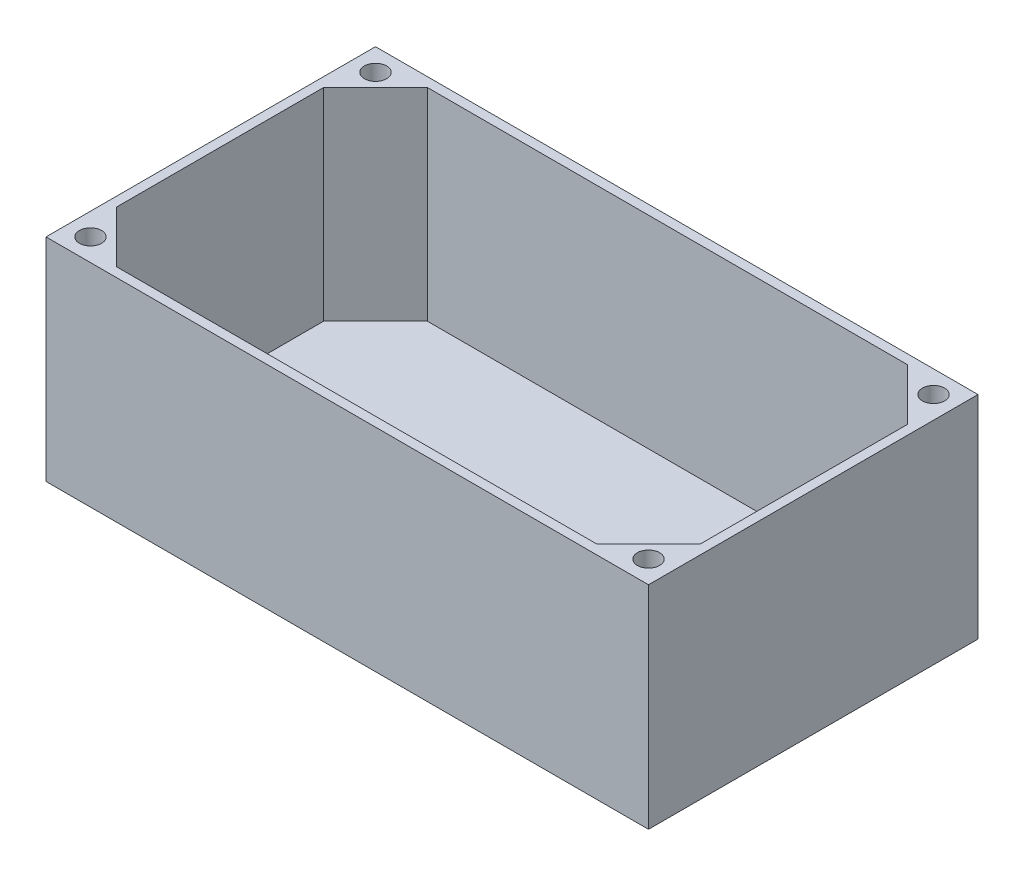
ISO-10303-21;
HEADER;
FILE_DESCRIPTION(('STEP AP214'),'2;1');
FILE_NAME('part.step','',(''),(''),'','','');
FILE_SCHEMA(('AUTOMOTIVE_DESIGN { 1 0 10303 214 1 1 1 1 }'));
ENDSEC;
DATA;
#1=APPLICATION_CONTEXT('core data for automotive mechanical design processes');
#2=APPLICATION_PROTOCOL_DEFINITION('international standard','automotive_design',2000,#1);
#3=PRODUCT_CONTEXT('',#1,'mechanical');
#4=PRODUCT('Part','Part','',(#3));
#5=PRODUCT_RELATED_PRODUCT_CATEGORY('part','',(#4));
#6=PRODUCT_DEFINITION_FORMATION('','',#4);
#7=PRODUCT_DEFINITION_CONTEXT('part definition',#1,'design');
#8=PRODUCT_DEFINITION('design','',#6,#7);
#9=PRODUCT_DEFINITION_SHAPE('','',#8);
#10=(LENGTH_UNIT() NAMED_UNIT(*) SI_UNIT(.MILLI.,.METRE.));
#11=(NAMED_UNIT(*) PLANE_ANGLE_UNIT() SI_UNIT($,.RADIAN.));
#12=(NAMED_UNIT(*) SI_UNIT($,.STERADIAN.) SOLID_ANGLE_UNIT());
#13=UNCERTAINTY_MEASURE_WITH_UNIT(LENGTH_MEASURE(1.E-05),#10,'distance_accuracy_value','');
#14=(GEOMETRIC_REPRESENTATION_CONTEXT(3) GLOBAL_UNCERTAINTY_ASSIGNED_CONTEXT((#13)) GLOBAL_UNIT_ASSIGNED_CONTEXT((#10,
#11,#12)) REPRESENTATION_CONTEXT('',''));
#15=CARTESIAN_POINT('',(0.,0.,0.));
#16=DIRECTION('',(0.,0.,1.));
#17=DIRECTION('',(1.,0.,0.));
#18=AXIS2_PLACEMENT_3D('',#15,#16,#17);
#19=CARTESIAN_POINT('',(0.,1.27,0.));
#20=DIRECTION('',(0.,-1.,0.));
#21=DIRECTION('',(0.,0.,-1.));
#22=AXIS2_PLACEMENT_3D('',#19,#20,#21);
#23=PLANE('',#22);
#24=CARTESIAN_POINT('',(67.31,1.27,-31.75));
#25=DIRECTION('',(0.,-1.,0.));
#26=DIRECTION('',(0.,0.,-1.));
#27=AXIS2_PLACEMENT_3D('',#24,#25,#26);
#28=CIRCLE('',#27,4.445);
#29=CARTESIAN_POINT('',(67.31,1.27,-36.195));
#30=VERTEX_POINT('',#29);
#31=EDGE_CURVE('E48',#30,#30,#28,.F.);
#32=ORIENTED_EDGE('',*,*,#31,.F.);
#33=EDGE_LOOP('',(#32));
#34=FACE_BOUND('',#33,.T.);
#35=DIRECTION('',(0.,0.,1.));
#36=VECTOR('',#35,1.);
#37=CARTESIAN_POINT('',(1.27,1.27,0.));
#38=LINE('',#37,#36);
#39=CARTESIAN_POINT('',(1.26999999999998,1.27,-36.195));
#40=VERTEX_POINT('',#39);
#41=CARTESIAN_POINT('',(1.26999999999999,1.27,-8.25500000000007));
#42=VERTEX_POINT('',#41);
#43=EDGE_CURVE('E287',#40,#42,#38,.T.);
#44=ORIENTED_EDGE('',*,*,#43,.T.);
#45=DIRECTION('',(-0.707106781186544,0.,-0.707106781186551));
#46=VECTOR('',#45,1.);
#47=CARTESIAN_POINT('',(1.26999999999999,1.27,-8.25500000000007));
#48=LINE('',#47,#46);
#49=CARTESIAN_POINT('',(8.255,1.27,-1.27));
#50=VERTEX_POINT('',#49);
#51=EDGE_CURVE('E362',#42,#50,#48,.F.);
#52=ORIENTED_EDGE('',*,*,#51,.T.);
#53=DIRECTION('',(1.,0.,0.));
#54=VECTOR('',#53,1.);
#55=CARTESIAN_POINT('',(0.,1.27,-1.27));
#56=LINE('',#55,#54);
#57=CARTESIAN_POINT('',(73.0249999999999,1.27,-1.27));
#58=VERTEX_POINT('',#57);
#59=EDGE_CURVE('E292',#50,#58,#56,.T.);
#60=ORIENTED_EDGE('',*,*,#59,.T.);
#61=DIRECTION('',(-0.70710678118655,0.,0.707106781186545));
#62=VECTOR('',#61,1.);
#63=CARTESIAN_POINT('',(73.0249999999999,1.27,-1.27));
#64=LINE('',#63,#62);
#65=CARTESIAN_POINT('',(80.01,1.27,-8.25499999999999));
#66=VERTEX_POINT('',#65);
#67=EDGE_CURVE('E360',#58,#66,#64,.F.);
#68=ORIENTED_EDGE('',*,*,#67,.T.);
#69=DIRECTION('',(0.,0.,-1.));
#70=VECTOR('',#69,1.);
#71=CARTESIAN_POINT('',(80.01,1.27,0.));
#72=LINE('',#71,#70);
#73=CARTESIAN_POINT('',(80.01,1.27,-36.1949999999999));
#74=VERTEX_POINT('',#73);
#75=EDGE_CURVE('E295',#66,#74,#72,.T.);
#76=ORIENTED_EDGE('',*,*,#75,.T.);
#77=DIRECTION('',(0.707106781186544,0.,0.707106781186551));
#78=VECTOR('',#77,1.);
#79=CARTESIAN_POINT('',(80.01,1.27,-36.1949999999999));
#80=LINE('',#79,#78);
#81=CARTESIAN_POINT('',(73.025,1.27,-43.18));
#82=VERTEX_POINT('',#81);
#83=EDGE_CURVE('E357',#74,#82,#80,.F.);
#84=ORIENTED_EDGE('',*,*,#83,.T.);
#85=DIRECTION('',(-1.,0.,0.));
#86=VECTOR('',#85,1.);
#87=CARTESIAN_POINT('',(0.,1.27,-43.18));
#88=LINE('',#87,#86);
#89=CARTESIAN_POINT('',(8.25500000000001,1.27,-43.18));
#90=VERTEX_POINT('',#89);
#91=EDGE_CURVE('E299',#82,#90,#88,.T.);
#92=ORIENTED_EDGE('',*,*,#91,.T.);
#93=DIRECTION('',(0.70710678118655,0.,-0.707106781186545));
#94=VECTOR('',#93,1.);
#95=CARTESIAN_POINT('',(8.25500000000001,1.27,-43.18));
#96=LINE('',#95,#94);
#97=EDGE_CURVE('E355',#90,#40,#96,.F.);
#98=ORIENTED_EDGE('',*,*,#97,.T.);
#99=EDGE_LOOP('',(#44,#52,#60,#68,#76,#84,#92,#98));
#100=FACE_BOUND('',#99,.T.);
#101=DIRECTION('',(-1.,0.,0.));
#102=VECTOR('',#101,1.);
#103=CARTESIAN_POINT('',(5.61999999999998,1.27,-28.225));
#104=LINE('',#103,#102);
#105=CARTESIAN_POINT('',(9.61999999999998,1.27,-28.225));
#106=VERTEX_POINT('',#105);
#107=CARTESIAN_POINT('',(5.61999999999998,1.27,-28.225));
#108=VERTEX_POINT('',#107);
#109=EDGE_CURVE('E248',#106,#108,#104,.T.);
#110=ORIENTED_EDGE('',*,*,#109,.F.);
#111=DIRECTION('',(0.,0.,-1.));
#112=VECTOR('',#111,1.);
#113=CARTESIAN_POINT('',(9.61999999999998,1.27,-28.225));
#114=LINE('',#113,#112);
#115=CARTESIAN_POINT('',(9.61999999999998,1.27,-16.225));
#116=VERTEX_POINT('',#115);
#117=EDGE_CURVE('E246',#116,#106,#114,.T.);
#118=ORIENTED_EDGE('',*,*,#117,.F.);
#119=DIRECTION('',(1.,0.,0.));
#120=VECTOR('',#119,1.);
#121=CARTESIAN_POINT('',(5.61999999999998,1.27,-16.225));
#122=LINE('',#121,#120);
#123=CARTESIAN_POINT('',(5.61999999999998,1.27,-16.225));
#124=VERTEX_POINT('',#123);
#125=EDGE_CURVE('E238',#124,#116,#122,.T.);
#126=ORIENTED_EDGE('',*,*,#125,.F.);
#127=DIRECTION('',(0.,0.,1.));
#128=VECTOR('',#127,1.);
#129=CARTESIAN_POINT('',(5.61999999999998,1.27,-28.225));
#130=LINE('',#129,#128);
#131=EDGE_CURVE('E252',#108,#124,#130,.T.);
#132=ORIENTED_EDGE('',*,*,#131,.F.);
#133=EDGE_LOOP('',(#110,#118,#126,#132));
#134=FACE_BOUND('',#133,.T.);
#135=DIRECTION('',(0.,0.,-1.));
#136=VECTOR('',#135,1.);
#137=CARTESIAN_POINT('',(49.022,1.27,-28.321));
#138=LINE('',#137,#136);
#139=CARTESIAN_POINT('',(49.022,1.27,-16.129));
#140=VERTEX_POINT('',#139);
#141=CARTESIAN_POINT('',(49.022,1.27,-28.321));
#142=VERTEX_POINT('',#141);
#143=EDGE_CURVE('E188',#140,#142,#138,.T.);
#144=ORIENTED_EDGE('',*,*,#143,.F.);
#145=DIRECTION('',(1.,0.,0.));
#146=VECTOR('',#145,1.);
#147=CARTESIAN_POINT('',(32.258,1.27,-16.129));
#148=LINE('',#147,#146);
#149=CARTESIAN_POINT('',(32.258,1.27,-16.129));
#150=VERTEX_POINT('',#149);
#151=EDGE_CURVE('E204',#150,#140,#148,.T.);
#152=ORIENTED_EDGE('',*,*,#151,.F.);
#153=DIRECTION('',(0.,0.,1.));
#154=VECTOR('',#153,1.);
#155=CARTESIAN_POINT('',(32.258,1.27,-28.321));
#156=LINE('',#155,#154);
#157=CARTESIAN_POINT('',(32.258,1.27,-28.321));
#158=VERTEX_POINT('',#157);
#159=EDGE_CURVE('E209',#158,#150,#156,.T.);
#160=ORIENTED_EDGE('',*,*,#159,.F.);
#161=DIRECTION('',(-1.,0.,0.));
#162=VECTOR('',#161,1.);
#163=CARTESIAN_POINT('',(32.258,1.27,-28.321));
#164=LINE('',#163,#162);
#165=EDGE_CURVE('E219',#142,#158,#164,.T.);
#166=ORIENTED_EDGE('',*,*,#165,.F.);
#167=EDGE_LOOP('',(#144,#152,#160,#166));
#168=FACE_BOUND('',#167,.T.);
#169=CARTESIAN_POINT('',(67.31,1.27,-18.415));
#170=DIRECTION('',(0.,-1.,0.));
#171=DIRECTION('',(0.,0.,-1.));
#172=AXIS2_PLACEMENT_3D('',#169,#170,#171);
#173=CIRCLE('',#172,5.71499999999999);
#174=CARTESIAN_POINT('',(67.31,1.27,-24.13));
#175=VERTEX_POINT('',#174);
#176=EDGE_CURVE('E11',#175,#175,#173,.F.);
#177=ORIENTED_EDGE('',*,*,#176,.F.);
#178=EDGE_LOOP('',(#177));
#179=FACE_BOUND('',#178,.T.);
#180=ADVANCED_FACE('F39',(#34,#100,#134,#168,#179),#23,.F.);
#181=CARTESIAN_POINT('',(0.,28.575,0.));
#182=DIRECTION('',(0.,-1.,0.));
#183=DIRECTION('',(0.,0.,-1.));
#184=AXIS2_PLACEMENT_3D('',#181,#182,#183);
#185=PLANE('',#184);
#186=CARTESIAN_POINT('',(78.28,28.575,-41.45));
#187=DIRECTION('',(0.,1.,0.));
#188=DIRECTION('',(0.,0.,1.));
#189=AXIS2_PLACEMENT_3D('',#186,#187,#188);
#190=CIRCLE('',#189,1.5);
#191=CARTESIAN_POINT('',(78.28,28.575,-39.95));
#192=VERTEX_POINT('',#191);
#193=EDGE_CURVE('E281',#192,#192,#190,.T.);
#194=ORIENTED_EDGE('',*,*,#193,.F.);
#195=EDGE_LOOP('',(#194));
#196=FACE_BOUND('',#195,.T.);
#197=CARTESIAN_POINT('',(78.28,28.575,-3.));
#198=DIRECTION('',(0.,1.,0.));
#199=DIRECTION('',(0.,0.,1.));
#200=AXIS2_PLACEMENT_3D('',#197,#198,#199);
#201=CIRCLE('',#200,1.5);
#202=CARTESIAN_POINT('',(78.28,28.575,-1.5));
#203=VERTEX_POINT('',#202);
#204=EDGE_CURVE('E274',#203,#203,#201,.T.);
#205=ORIENTED_EDGE('',*,*,#204,.F.);
#206=EDGE_LOOP('',(#205));
#207=FACE_BOUND('',#206,.T.);
#208=CARTESIAN_POINT('',(2.99999999999997,28.575,-3.));
#209=DIRECTION('',(0.,1.,0.));
#210=DIRECTION('',(0.,0.,1.));
#211=AXIS2_PLACEMENT_3D('',#208,#209,#210);
#212=CIRCLE('',#211,1.5);
#213=CARTESIAN_POINT('',(2.99999999999997,28.575,-1.5));
#214=VERTEX_POINT('',#213);
#215=EDGE_CURVE('E268',#214,#214,#212,.T.);
#216=ORIENTED_EDGE('',*,*,#215,.F.);
#217=EDGE_LOOP('',(#216));
#218=FACE_BOUND('',#217,.T.);
#219=CARTESIAN_POINT('',(2.99999999999998,28.575,-41.45));
#220=DIRECTION('',(0.,1.,0.));
#221=DIRECTION('',(0.,0.,1.));
#222=AXIS2_PLACEMENT_3D('',#219,#220,#221);
#223=CIRCLE('',#222,1.5);
#224=CARTESIAN_POINT('',(2.99999999999998,28.575,-39.95));
#225=VERTEX_POINT('',#224);
#226=EDGE_CURVE('E267',#225,#225,#223,.T.);
#227=ORIENTED_EDGE('',*,*,#226,.F.);
#228=EDGE_LOOP('',(#227));
#229=FACE_BOUND('',#228,.T.);
#230=DIRECTION('',(0.,0.,1.));
#231=VECTOR('',#230,1.);
#232=CARTESIAN_POINT('',(0.,28.575,0.));
#233=LINE('',#232,#231);
#234=CARTESIAN_POINT('',(0.,28.575,-44.45));
#235=VERTEX_POINT('',#234);
#236=CARTESIAN_POINT('',(0.,28.575,0.));
#237=VERTEX_POINT('',#236);
#238=EDGE_CURVE('E317',#235,#237,#233,.T.);
#239=ORIENTED_EDGE('',*,*,#238,.T.);
#240=DIRECTION('',(1.,0.,0.));
#241=VECTOR('',#240,1.);
#242=CARTESIAN_POINT('',(0.,28.575,0.));
#243=LINE('',#242,#241);
#244=CARTESIAN_POINT('',(81.28,28.575,0.));
#245=VERTEX_POINT('',#244);
#246=EDGE_CURVE('E320',#237,#245,#243,.T.);
#247=ORIENTED_EDGE('',*,*,#246,.T.);
#248=DIRECTION('',(0.,0.,-1.));
#249=VECTOR('',#248,1.);
#250=CARTESIAN_POINT('',(81.28,28.575,0.));
#251=LINE('',#250,#249);
#252=CARTESIAN_POINT('',(81.28,28.575,-44.45));
#253=VERTEX_POINT('',#252);
#254=EDGE_CURVE('E323',#245,#253,#251,.T.);
#255=ORIENTED_EDGE('',*,*,#254,.T.);
#256=DIRECTION('',(-1.,0.,0.));
#257=VECTOR('',#256,1.);
#258=CARTESIAN_POINT('',(0.,28.575,-44.45));
#259=LINE('',#258,#257);
#260=EDGE_CURVE('E325',#253,#235,#259,.T.);
#261=ORIENTED_EDGE('',*,*,#260,.T.);
#262=EDGE_LOOP('',(#239,#247,#255,#261));
#263=FACE_BOUND('',#262,.T.);
#264=DIRECTION('',(0.,0.,1.));
#265=VECTOR('',#264,1.);
#266=CARTESIAN_POINT('',(1.27,28.575,0.));
#267=LINE('',#266,#265);
#268=CARTESIAN_POINT('',(1.26999999999998,28.575,-36.195));
#269=VERTEX_POINT('',#268);
#270=CARTESIAN_POINT('',(1.26999999999999,28.575,-8.25500000000007));
#271=VERTEX_POINT('',#270);
#272=EDGE_CURVE('E303',#269,#271,#267,.T.);
#273=ORIENTED_EDGE('',*,*,#272,.F.);
#274=DIRECTION('',(-0.70710678118655,0.,0.707106781186545));
#275=VECTOR('',#274,1.);
#276=CARTESIAN_POINT('',(-17.4625,28.575,-17.4625000000002));
#277=LINE('',#276,#275);
#278=CARTESIAN_POINT('',(8.25500000000001,28.575,-43.18));
#279=VERTEX_POINT('',#278);
#280=EDGE_CURVE('E386',#269,#279,#277,.F.);
#281=ORIENTED_EDGE('',*,*,#280,.T.);
#282=DIRECTION('',(-1.,0.,0.));
#283=VECTOR('',#282,1.);
#284=CARTESIAN_POINT('',(0.,28.575,-43.18));
#285=LINE('',#284,#283);
#286=CARTESIAN_POINT('',(73.025,28.575,-43.18));
#287=VERTEX_POINT('',#286);
#288=EDGE_CURVE('E312',#287,#279,#285,.T.);
#289=ORIENTED_EDGE('',*,*,#288,.F.);
#290=DIRECTION('',(-0.707106781186544,0.,-0.707106781186551));
#291=VECTOR('',#290,1.);
#292=CARTESIAN_POINT('',(58.1025000000003,28.575,-58.1024999999998));
#293=LINE('',#292,#291);
#294=CARTESIAN_POINT('',(80.01,28.575,-36.1949999999999));
#295=VERTEX_POINT('',#294);
#296=EDGE_CURVE('E384',#287,#295,#293,.F.);
#297=ORIENTED_EDGE('',*,*,#296,.T.);
#298=DIRECTION('',(0.,0.,-1.));
#299=VECTOR('',#298,1.);
#300=CARTESIAN_POINT('',(80.01,28.575,0.));
#301=LINE('',#300,#299);
#302=CARTESIAN_POINT('',(80.01,28.575,-8.25499999999999));
#303=VERTEX_POINT('',#302);
#304=EDGE_CURVE('E309',#303,#295,#301,.T.);
#305=ORIENTED_EDGE('',*,*,#304,.F.);
#306=DIRECTION('',(0.70710678118655,0.,-0.707106781186545));
#307=VECTOR('',#306,1.);
#308=CARTESIAN_POINT('',(35.8774999999997,28.575,35.8775));
#309=LINE('',#308,#307);
#310=CARTESIAN_POINT('',(73.0249999999999,28.575,-1.27));
#311=VERTEX_POINT('',#310);
#312=EDGE_CURVE('E382',#303,#311,#309,.F.);
#313=ORIENTED_EDGE('',*,*,#312,.T.);
#314=DIRECTION('',(1.,0.,0.));
#315=VECTOR('',#314,1.);
#316=CARTESIAN_POINT('',(0.,28.575,-1.27));
#317=LINE('',#316,#315);
#318=CARTESIAN_POINT('',(8.255,28.575,-1.27));
#319=VERTEX_POINT('',#318);
#320=EDGE_CURVE('E306',#319,#311,#317,.T.);
#321=ORIENTED_EDGE('',*,*,#320,.F.);
#322=DIRECTION('',(0.707106781186544,0.,0.707106781186551));
#323=VECTOR('',#322,1.);
#324=CARTESIAN_POINT('',(4.76250000000004,28.575,-4.76249999999999));
#325=LINE('',#324,#323);
#326=EDGE_CURVE('E380',#319,#271,#325,.F.);
#327=ORIENTED_EDGE('',*,*,#326,.T.);
#328=EDGE_LOOP('',(#273,#281,#289,#297,#305,#313,#321,#327));
#329=FACE_BOUND('',#328,.T.);
#330=ADVANCED_FACE('F397',(#196,#207,#218,#229,#263,#329),#185,.F.);
#331=CARTESIAN_POINT('',(0.,28.575,0.));
#332=DIRECTION('',(1.,0.,0.));
#333=DIRECTION('',(0.,0.,-1.));
#334=AXIS2_PLACEMENT_3D('',#331,#332,#333);
#335=PLANE('',#334);
#336=DIRECTION('',(0.,0.,1.));
#337=VECTOR('',#336,1.);
#338=CARTESIAN_POINT('',(0.,0.,0.));
#339=LINE('',#338,#337);
#340=CARTESIAN_POINT('',(0.,0.,-44.45));
#341=VERTEX_POINT('',#340);
#342=CARTESIAN_POINT('',(0.,0.,0.));
#343=VERTEX_POINT('',#342);
#344=EDGE_CURVE('E316',#341,#343,#339,.T.);
#345=ORIENTED_EDGE('',*,*,#344,.T.);
#346=DIRECTION('',(0.,-1.,0.));
#347=VECTOR('',#346,1.);
#348=CARTESIAN_POINT('',(0.,28.575,0.));
#349=LINE('',#348,#347);
#350=EDGE_CURVE('E347',#237,#343,#349,.T.);
#351=ORIENTED_EDGE('',*,*,#350,.F.);
#352=ORIENTED_EDGE('',*,*,#238,.F.);
#353=DIRECTION('',(0.,-1.,0.));
#354=VECTOR('',#353,1.);
#355=CARTESIAN_POINT('',(0.,28.575,-44.45));
#356=LINE('',#355,#354);
#357=EDGE_CURVE('E328',#235,#341,#356,.T.);
#358=ORIENTED_EDGE('',*,*,#357,.T.);
#359=EDGE_LOOP('',(#345,#351,#352,#358));
#360=FACE_BOUND('',#359,.T.);
#361=ADVANCED_FACE('F497',(#360),#335,.F.);
#362=CARTESIAN_POINT('',(0.,28.575,0.));
#363=DIRECTION('',(0.,0.,-1.));
#364=DIRECTION('',(-1.,0.,0.));
#365=AXIS2_PLACEMENT_3D('',#362,#363,#364);
#366=PLANE('',#365);
#367=DIRECTION('',(1.,0.,0.));
#368=VECTOR('',#367,1.);
#369=CARTESIAN_POINT('',(0.,0.,0.));
#370=LINE('',#369,#368);
#371=CARTESIAN_POINT('',(81.28,0.,0.));
#372=VERTEX_POINT('',#371);
#373=EDGE_CURVE('E331',#343,#372,#370,.T.);
#374=ORIENTED_EDGE('',*,*,#373,.T.);
#375=DIRECTION('',(0.,-1.,0.));
#376=VECTOR('',#375,1.);
#377=CARTESIAN_POINT('',(81.28,28.575,0.));
#378=LINE('',#377,#376);
#379=EDGE_CURVE('E344',#245,#372,#378,.T.);
#380=ORIENTED_EDGE('',*,*,#379,.F.);
#381=ORIENTED_EDGE('',*,*,#246,.F.);
#382=ORIENTED_EDGE('',*,*,#350,.T.);
#383=EDGE_LOOP('',(#374,#380,#381,#382));
#384=FACE_BOUND('',#383,.T.);
#385=ADVANCED_FACE('F509',(#384),#366,.F.);
#386=CARTESIAN_POINT('',(81.28,28.575,0.));
#387=DIRECTION('',(-1.,0.,0.));
#388=DIRECTION('',(0.,0.,1.));
#389=AXIS2_PLACEMENT_3D('',#386,#387,#388);
#390=PLANE('',#389);
#391=DIRECTION('',(0.,0.,-1.));
#392=VECTOR('',#391,1.);
#393=CARTESIAN_POINT('',(81.28,0.,0.));
#394=LINE('',#393,#392);
#395=CARTESIAN_POINT('',(81.28,0.,-44.45));
#396=VERTEX_POINT('',#395);
#397=EDGE_CURVE('E333',#372,#396,#394,.T.);
#398=ORIENTED_EDGE('',*,*,#397,.T.);
#399=DIRECTION('',(0.,-1.,0.));
#400=VECTOR('',#399,1.);
#401=CARTESIAN_POINT('',(81.28,28.575,-44.45));
#402=LINE('',#401,#400);
#403=EDGE_CURVE('E340',#253,#396,#402,.T.);
#404=ORIENTED_EDGE('',*,*,#403,.F.);
#405=ORIENTED_EDGE('',*,*,#254,.F.);
#406=ORIENTED_EDGE('',*,*,#379,.T.);
#407=EDGE_LOOP('',(#398,#404,#405,#406));
#408=FACE_BOUND('',#407,.T.);
#409=ADVANCED_FACE('F505',(#408),#390,.F.);
#410=CARTESIAN_POINT('',(0.,28.575,-44.45));
#411=DIRECTION('',(0.,0.,1.));
#412=DIRECTION('',(1.,0.,0.));
#413=AXIS2_PLACEMENT_3D('',#410,#411,#412);
#414=PLANE('',#413);
#415=DIRECTION('',(-1.,0.,0.));
#416=VECTOR('',#415,1.);
#417=CARTESIAN_POINT('',(0.,0.,-44.45));
#418=LINE('',#417,#416);
#419=EDGE_CURVE('E321',#396,#341,#418,.T.);
#420=ORIENTED_EDGE('',*,*,#419,.T.);
#421=ORIENTED_EDGE('',*,*,#357,.F.);
#422=ORIENTED_EDGE('',*,*,#260,.F.);
#423=ORIENTED_EDGE('',*,*,#403,.T.);
#424=EDGE_LOOP('',(#420,#421,#422,#423));
#425=FACE_BOUND('',#424,.T.);
#426=ADVANCED_FACE('F501',(#425),#414,.F.);
#427=CARTESIAN_POINT('',(0.,0.,0.));
#428=DIRECTION('',(0.,-1.,0.));
#429=DIRECTION('',(0.,0.,-1.));
#430=AXIS2_PLACEMENT_3D('',#427,#428,#429);
#431=PLANE('',#430);
#432=CARTESIAN_POINT('',(67.31,0.,-31.75));
#433=DIRECTION('',(0.,1.,0.));
#434=DIRECTION('',(0.,0.,1.));
#435=AXIS2_PLACEMENT_3D('',#432,#433,#434);
#436=CIRCLE('',#435,3.175);
#437=CARTESIAN_POINT('',(67.31,0.,-28.575));
#438=VERTEX_POINT('',#437);
#439=EDGE_CURVE('E212',#438,#438,#436,.T.);
#440=ORIENTED_EDGE('',*,*,#439,.T.);
#441=EDGE_LOOP('',(#440));
#442=FACE_BOUND('',#441,.T.);
#443=DIRECTION('',(0.,0.,-1.));
#444=VECTOR('',#443,1.);
#445=CARTESIAN_POINT('',(49.022,0.,-28.321));
#446=LINE('',#445,#444);
#447=CARTESIAN_POINT('',(49.022,0.,-16.129));
#448=VERTEX_POINT('',#447);
#449=CARTESIAN_POINT('',(49.022,0.,-28.321));
#450=VERTEX_POINT('',#449);
#451=EDGE_CURVE('E185',#448,#450,#446,.T.);
#452=ORIENTED_EDGE('',*,*,#451,.T.);
#453=DIRECTION('',(-1.,0.,0.));
#454=VECTOR('',#453,1.);
#455=CARTESIAN_POINT('',(32.258,0.,-28.321));
#456=LINE('',#455,#454);
#457=CARTESIAN_POINT('',(32.258,0.,-28.321));
#458=VERTEX_POINT('',#457);
#459=EDGE_CURVE('E196',#450,#458,#456,.T.);
#460=ORIENTED_EDGE('',*,*,#459,.T.);
#461=DIRECTION('',(0.,0.,1.));
#462=VECTOR('',#461,1.);
#463=CARTESIAN_POINT('',(32.258,0.,-28.321));
#464=LINE('',#463,#462);
#465=CARTESIAN_POINT('',(32.258,0.,-16.129));
#466=VERTEX_POINT('',#465);
#467=EDGE_CURVE('E55',#458,#466,#464,.T.);
#468=ORIENTED_EDGE('',*,*,#467,.T.);
#469=DIRECTION('',(1.,0.,0.));
#470=VECTOR('',#469,1.);
#471=CARTESIAN_POINT('',(32.258,0.,-16.129));
#472=LINE('',#471,#470);
#473=EDGE_CURVE('E193',#466,#448,#472,.T.);
#474=ORIENTED_EDGE('',*,*,#473,.T.);
#475=EDGE_LOOP('',(#452,#460,#468,#474));
#476=FACE_BOUND('',#475,.T.);
#477=CARTESIAN_POINT('',(67.31,0.,-18.415));
#478=DIRECTION('',(0.,1.,0.));
#479=DIRECTION('',(0.,0.,1.));
#480=AXIS2_PLACEMENT_3D('',#477,#478,#479);
#481=CIRCLE('',#480,4.445);
#482=CARTESIAN_POINT('',(67.31,0.,-13.97));
#483=VERTEX_POINT('',#482);
#484=EDGE_CURVE('E220',#483,#483,#481,.T.);
#485=ORIENTED_EDGE('',*,*,#484,.T.);
#486=EDGE_LOOP('',(#485));
#487=FACE_BOUND('',#486,.T.);
#488=DIRECTION('',(0.,0.,-1.));
#489=VECTOR('',#488,1.);
#490=CARTESIAN_POINT('',(9.61999999999998,0.,-28.225));
#491=LINE('',#490,#489);
#492=CARTESIAN_POINT('',(9.61999999999998,0.,-16.225));
#493=VERTEX_POINT('',#492);
#494=CARTESIAN_POINT('',(9.61999999999998,0.,-28.225));
#495=VERTEX_POINT('',#494);
#496=EDGE_CURVE('E234',#493,#495,#491,.T.);
#497=ORIENTED_EDGE('',*,*,#496,.T.);
#498=DIRECTION('',(-1.,0.,0.));
#499=VECTOR('',#498,1.);
#500=CARTESIAN_POINT('',(5.61999999999998,0.,-28.225));
#501=LINE('',#500,#499);
#502=CARTESIAN_POINT('',(5.61999999999998,0.,-28.225));
#503=VERTEX_POINT('',#502);
#504=EDGE_CURVE('E237',#495,#503,#501,.T.);
#505=ORIENTED_EDGE('',*,*,#504,.T.);
#506=DIRECTION('',(0.,0.,1.));
#507=VECTOR('',#506,1.);
#508=CARTESIAN_POINT('',(5.61999999999998,0.,-28.225));
#509=LINE('',#508,#507);
#510=CARTESIAN_POINT('',(5.61999999999998,0.,-16.225));
#511=VERTEX_POINT('',#510);
#512=EDGE_CURVE('E63',#503,#511,#509,.T.);
#513=ORIENTED_EDGE('',*,*,#512,.T.);
#514=DIRECTION('',(1.,0.,0.));
#515=VECTOR('',#514,1.);
#516=CARTESIAN_POINT('',(5.61999999999998,0.,-16.225));
#517=LINE('',#516,#515);
#518=EDGE_CURVE('E242',#511,#493,#517,.T.);
#519=ORIENTED_EDGE('',*,*,#518,.T.);
#520=EDGE_LOOP('',(#497,#505,#513,#519));
#521=FACE_BOUND('',#520,.T.);
#522=CARTESIAN_POINT('',(78.28,0.,-41.45));
#523=DIRECTION('',(0.,1.,0.));
#524=DIRECTION('',(0.,0.,1.));
#525=AXIS2_PLACEMENT_3D('',#522,#523,#524);
#526=CIRCLE('',#525,1.5);
#527=CARTESIAN_POINT('',(78.28,0.,-39.95));
#528=VERTEX_POINT('',#527);
#529=EDGE_CURVE('E277',#528,#528,#526,.T.);
#530=ORIENTED_EDGE('',*,*,#529,.T.);
#531=EDGE_LOOP('',(#530));
#532=FACE_BOUND('',#531,.T.);
#533=CARTESIAN_POINT('',(78.28,0.,-3.));
#534=DIRECTION('',(0.,1.,0.));
#535=DIRECTION('',(0.,0.,1.));
#536=AXIS2_PLACEMENT_3D('',#533,#534,#535);
#537=CIRCLE('',#536,1.5);
#538=CARTESIAN_POINT('',(78.28,0.,-1.5));
#539=VERTEX_POINT('',#538);
#540=EDGE_CURVE('E271',#539,#539,#537,.T.);
#541=ORIENTED_EDGE('',*,*,#540,.T.);
#542=EDGE_LOOP('',(#541));
#543=FACE_BOUND('',#542,.T.);
#544=CARTESIAN_POINT('',(2.99999999999997,0.,-3.));
#545=DIRECTION('',(0.,1.,0.));
#546=DIRECTION('',(0.,0.,1.));
#547=AXIS2_PLACEMENT_3D('',#544,#545,#546);
#548=CIRCLE('',#547,1.5);
#549=CARTESIAN_POINT('',(2.99999999999997,0.,-1.5));
#550=VERTEX_POINT('',#549);
#551=EDGE_CURVE('E264',#550,#550,#548,.T.);
#552=ORIENTED_EDGE('',*,*,#551,.T.);
#553=EDGE_LOOP('',(#552));
#554=FACE_BOUND('',#553,.T.);
#555=CARTESIAN_POINT('',(2.99999999999998,0.,-41.45));
#556=DIRECTION('',(0.,1.,0.));
#557=DIRECTION('',(0.,0.,1.));
#558=AXIS2_PLACEMENT_3D('',#555,#556,#557);
#559=CIRCLE('',#558,1.5);
#560=CARTESIAN_POINT('',(2.99999999999998,0.,-39.95));
#561=VERTEX_POINT('',#560);
#562=EDGE_CURVE('E284',#561,#561,#559,.T.);
#563=ORIENTED_EDGE('',*,*,#562,.T.);
#564=EDGE_LOOP('',(#563));
#565=FACE_BOUND('',#564,.T.);
#566=ORIENTED_EDGE('',*,*,#344,.F.);
#567=ORIENTED_EDGE('',*,*,#419,.F.);
#568=ORIENTED_EDGE('',*,*,#397,.F.);
#569=ORIENTED_EDGE('',*,*,#373,.F.);
#570=EDGE_LOOP('',(#566,#567,#568,#569));
#571=FACE_BOUND('',#570,.T.);
#572=ADVANCED_FACE('F200',(#442,#476,#487,#521,#532,#543,#554,#565,#571),#431,.T.);
#573=CARTESIAN_POINT('',(1.27,28.575,0.));
#574=DIRECTION('',(1.,0.,0.));
#575=DIRECTION('',(0.,0.,-1.));
#576=AXIS2_PLACEMENT_3D('',#573,#574,#575);
#577=PLANE('',#576);
#578=ORIENTED_EDGE('',*,*,#272,.T.);
#579=DIRECTION('',(0.,-1.,0.));
#580=VECTOR('',#579,1.);
#581=CARTESIAN_POINT('',(1.26999999999999,1.27,-8.25500000000007));
#582=LINE('',#581,#580);
#583=EDGE_CURVE('E352',#271,#42,#582,.T.);
#584=ORIENTED_EDGE('',*,*,#583,.T.);
#585=ORIENTED_EDGE('',*,*,#43,.F.);
#586=DIRECTION('',(0.,1.,0.));
#587=VECTOR('',#586,1.);
#588=CARTESIAN_POINT('',(1.26999999999998,28.575,-36.195));
#589=LINE('',#588,#587);
#590=EDGE_CURVE('E350',#40,#269,#589,.T.);
#591=ORIENTED_EDGE('',*,*,#590,.T.);
#592=EDGE_LOOP('',(#578,#584,#585,#591));
#593=FACE_BOUND('',#592,.T.);
#594=ADVANCED_FACE('F478',(#593),#577,.T.);
#595=CARTESIAN_POINT('',(0.,28.575,-1.27));
#596=DIRECTION('',(0.,0.,-1.));
#597=DIRECTION('',(-1.,0.,0.));
#598=AXIS2_PLACEMENT_3D('',#595,#596,#597);
#599=PLANE('',#598);
#600=ORIENTED_EDGE('',*,*,#59,.F.);
#601=DIRECTION('',(0.,1.,0.));
#602=VECTOR('',#601,1.);
#603=CARTESIAN_POINT('',(8.255,28.575,-1.27));
#604=LINE('',#603,#602);
#605=EDGE_CURVE('E367',#50,#319,#604,.T.);
#606=ORIENTED_EDGE('',*,*,#605,.T.);
#607=ORIENTED_EDGE('',*,*,#320,.T.);
#608=DIRECTION('',(0.,-1.,0.));
#609=VECTOR('',#608,1.);
#610=CARTESIAN_POINT('',(73.0249999999999,1.27,-1.27));
#611=LINE('',#610,#609);
#612=EDGE_CURVE('E364',#311,#58,#611,.T.);
#613=ORIENTED_EDGE('',*,*,#612,.T.);
#614=EDGE_LOOP('',(#600,#606,#607,#613));
#615=FACE_BOUND('',#614,.T.);
#616=ADVANCED_FACE('F481',(#615),#599,.T.);
#617=CARTESIAN_POINT('',(80.01,28.575,0.));
#618=DIRECTION('',(-1.,0.,0.));
#619=DIRECTION('',(0.,0.,1.));
#620=AXIS2_PLACEMENT_3D('',#617,#618,#619);
#621=PLANE('',#620);
#622=ORIENTED_EDGE('',*,*,#75,.F.);
#623=DIRECTION('',(0.,1.,0.));
#624=VECTOR('',#623,1.);
#625=CARTESIAN_POINT('',(80.01,28.575,-8.25499999999999));
#626=LINE('',#625,#624);
#627=EDGE_CURVE('E372',#66,#303,#626,.T.);
#628=ORIENTED_EDGE('',*,*,#627,.T.);
#629=ORIENTED_EDGE('',*,*,#304,.T.);
#630=DIRECTION('',(0.,-1.,0.));
#631=VECTOR('',#630,1.);
#632=CARTESIAN_POINT('',(80.01,1.27,-36.1949999999999));
#633=LINE('',#632,#631);
#634=EDGE_CURVE('E369',#295,#74,#633,.T.);
#635=ORIENTED_EDGE('',*,*,#634,.T.);
#636=EDGE_LOOP('',(#622,#628,#629,#635));
#637=FACE_BOUND('',#636,.T.);
#638=ADVANCED_FACE('F485',(#637),#621,.T.);
#639=CARTESIAN_POINT('',(0.,28.575,-43.18));
#640=DIRECTION('',(0.,0.,1.));
#641=DIRECTION('',(1.,0.,0.));
#642=AXIS2_PLACEMENT_3D('',#639,#640,#641);
#643=PLANE('',#642);
#644=ORIENTED_EDGE('',*,*,#91,.F.);
#645=DIRECTION('',(0.,1.,0.));
#646=VECTOR('',#645,1.);
#647=CARTESIAN_POINT('',(73.025,28.575,-43.18));
#648=LINE('',#647,#646);
#649=EDGE_CURVE('E377',#82,#287,#648,.T.);
#650=ORIENTED_EDGE('',*,*,#649,.T.);
#651=ORIENTED_EDGE('',*,*,#288,.T.);
#652=DIRECTION('',(0.,-1.,0.));
#653=VECTOR('',#652,1.);
#654=CARTESIAN_POINT('',(8.25500000000001,1.27,-43.18));
#655=LINE('',#654,#653);
#656=EDGE_CURVE('E374',#279,#90,#655,.T.);
#657=ORIENTED_EDGE('',*,*,#656,.T.);
#658=EDGE_LOOP('',(#644,#650,#651,#657));
#659=FACE_BOUND('',#658,.T.);
#660=ADVANCED_FACE('F489',(#659),#643,.T.);
#661=CARTESIAN_POINT('',(1.26999999999999,28.575,-8.25500000000007));
#662=DIRECTION('',(0.707106781186551,0.,-0.707106781186544));
#663=DIRECTION('',(0.,1.,0.));
#664=AXIS2_PLACEMENT_3D('',#661,#662,#663);
#665=PLANE('',#664);
#666=ORIENTED_EDGE('',*,*,#326,.F.);
#667=ORIENTED_EDGE('',*,*,#605,.F.);
#668=ORIENTED_EDGE('',*,*,#51,.F.);
#669=ORIENTED_EDGE('',*,*,#583,.F.);
#670=EDGE_LOOP('',(#666,#667,#668,#669));
#671=FACE_BOUND('',#670,.T.);
#672=ADVANCED_FACE('F492',(#671),#665,.T.);
#673=CARTESIAN_POINT('',(73.0249999999999,28.575,-1.27));
#674=DIRECTION('',(-0.707106781186545,0.,-0.70710678118655));
#675=DIRECTION('',(0.,1.,0.));
#676=AXIS2_PLACEMENT_3D('',#673,#674,#675);
#677=PLANE('',#676);
#678=ORIENTED_EDGE('',*,*,#312,.F.);
#679=ORIENTED_EDGE('',*,*,#627,.F.);
#680=ORIENTED_EDGE('',*,*,#67,.F.);
#681=ORIENTED_EDGE('',*,*,#612,.F.);
#682=EDGE_LOOP('',(#678,#679,#680,#681));
#683=FACE_BOUND('',#682,.T.);
#684=ADVANCED_FACE('F519',(#683),#677,.T.);
#685=CARTESIAN_POINT('',(80.01,28.575,-36.1949999999999));
#686=DIRECTION('',(-0.707106781186551,0.,0.707106781186544));
#687=DIRECTION('',(0.,1.,0.));
#688=AXIS2_PLACEMENT_3D('',#685,#686,#687);
#689=PLANE('',#688);
#690=ORIENTED_EDGE('',*,*,#296,.F.);
#691=ORIENTED_EDGE('',*,*,#649,.F.);
#692=ORIENTED_EDGE('',*,*,#83,.F.);
#693=ORIENTED_EDGE('',*,*,#634,.F.);
#694=EDGE_LOOP('',(#690,#691,#692,#693));
#695=FACE_BOUND('',#694,.T.);
#696=ADVANCED_FACE('F522',(#695),#689,.T.);
#697=CARTESIAN_POINT('',(8.25500000000001,28.575,-43.18));
#698=DIRECTION('',(0.707106781186545,0.,0.70710678118655));
#699=DIRECTION('',(0.,1.,0.));
#700=AXIS2_PLACEMENT_3D('',#697,#698,#699);
#701=PLANE('',#700);
#702=ORIENTED_EDGE('',*,*,#280,.F.);
#703=ORIENTED_EDGE('',*,*,#590,.F.);
#704=ORIENTED_EDGE('',*,*,#97,.F.);
#705=ORIENTED_EDGE('',*,*,#656,.F.);
#706=EDGE_LOOP('',(#702,#703,#704,#705));
#707=FACE_BOUND('',#706,.T.);
#708=ADVANCED_FACE('F41',(#707),#701,.T.);
#709=CARTESIAN_POINT('',(2.99999999999998,0.,-41.45));
#710=DIRECTION('',(0.,1.,0.));
#711=DIRECTION('',(0.,0.,1.));
#712=AXIS2_PLACEMENT_3D('',#709,#710,#711);
#713=CYLINDRICAL_SURFACE('',#712,1.5);
#714=ORIENTED_EDGE('',*,*,#562,.F.);
#715=EDGE_LOOP('',(#714));
#716=FACE_BOUND('',#715,.T.);
#717=ORIENTED_EDGE('',*,*,#226,.T.);
#718=EDGE_LOOP('',(#717));
#719=FACE_BOUND('',#718,.T.);
#720=ADVANCED_FACE('F467',(#716,#719),#713,.F.);
#721=CARTESIAN_POINT('',(2.99999999999997,0.,-3.));
#722=DIRECTION('',(0.,1.,0.));
#723=DIRECTION('',(0.,0.,1.));
#724=AXIS2_PLACEMENT_3D('',#721,#722,#723);
#725=CYLINDRICAL_SURFACE('',#724,1.5);
#726=ORIENTED_EDGE('',*,*,#551,.F.);
#727=EDGE_LOOP('',(#726));
#728=FACE_BOUND('',#727,.T.);
#729=ORIENTED_EDGE('',*,*,#215,.T.);
#730=EDGE_LOOP('',(#729));
#731=FACE_BOUND('',#730,.T.);
#732=ADVANCED_FACE('F463',(#728,#731),#725,.F.);
#733=CARTESIAN_POINT('',(78.28,0.,-3.));
#734=DIRECTION('',(0.,1.,0.));
#735=DIRECTION('',(0.,0.,1.));
#736=AXIS2_PLACEMENT_3D('',#733,#734,#735);
#737=CYLINDRICAL_SURFACE('',#736,1.5);
#738=ORIENTED_EDGE('',*,*,#540,.F.);
#739=EDGE_LOOP('',(#738));
#740=FACE_BOUND('',#739,.T.);
#741=ORIENTED_EDGE('',*,*,#204,.T.);
#742=EDGE_LOOP('',(#741));
#743=FACE_BOUND('',#742,.T.);
#744=ADVANCED_FACE('F466',(#740,#743),#737,.F.);
#745=CARTESIAN_POINT('',(78.28,0.,-41.45));
#746=DIRECTION('',(0.,1.,0.));
#747=DIRECTION('',(0.,0.,1.));
#748=AXIS2_PLACEMENT_3D('',#745,#746,#747);
#749=CYLINDRICAL_SURFACE('',#748,1.5);
#750=ORIENTED_EDGE('',*,*,#529,.F.);
#751=EDGE_LOOP('',(#750));
#752=FACE_BOUND('',#751,.T.);
#753=ORIENTED_EDGE('',*,*,#193,.T.);
#754=EDGE_LOOP('',(#753));
#755=FACE_BOUND('',#754,.T.);
#756=ADVANCED_FACE('F461',(#752,#755),#749,.F.);
#757=CARTESIAN_POINT('',(9.61999999999998,0.,-28.225));
#758=DIRECTION('',(1.,0.,0.));
#759=DIRECTION('',(0.,0.,-1.));
#760=AXIS2_PLACEMENT_3D('',#757,#758,#759);
#761=PLANE('',#760);
#762=ORIENTED_EDGE('',*,*,#117,.T.);
#763=DIRECTION('',(0.,1.,0.));
#764=VECTOR('',#763,1.);
#765=CARTESIAN_POINT('',(9.61999999999998,0.,-28.225));
#766=LINE('',#765,#764);
#767=EDGE_CURVE('E245',#495,#106,#766,.T.);
#768=ORIENTED_EDGE('',*,*,#767,.F.);
#769=ORIENTED_EDGE('',*,*,#496,.F.);
#770=DIRECTION('',(0.,1.,0.));
#771=VECTOR('',#770,1.);
#772=CARTESIAN_POINT('',(9.61999999999998,0.,-16.225));
#773=LINE('',#772,#771);
#774=EDGE_CURVE('E233',#493,#116,#773,.T.);
#775=ORIENTED_EDGE('',*,*,#774,.T.);
#776=EDGE_LOOP('',(#762,#768,#769,#775));
#777=FACE_BOUND('',#776,.T.);
#778=ADVANCED_FACE('F452',(#777),#761,.F.);
#779=CARTESIAN_POINT('',(5.61999999999998,0.,-16.225));
#780=DIRECTION('',(0.,0.,1.));
#781=DIRECTION('',(1.,0.,0.));
#782=AXIS2_PLACEMENT_3D('',#779,#780,#781);
#783=PLANE('',#782);
#784=ORIENTED_EDGE('',*,*,#125,.T.);
#785=ORIENTED_EDGE('',*,*,#774,.F.);
#786=ORIENTED_EDGE('',*,*,#518,.F.);
#787=DIRECTION('',(0.,1.,0.));
#788=VECTOR('',#787,1.);
#789=CARTESIAN_POINT('',(5.61999999999998,0.,-16.225));
#790=LINE('',#789,#788);
#791=EDGE_CURVE('E258',#511,#124,#790,.T.);
#792=ORIENTED_EDGE('',*,*,#791,.T.);
#793=EDGE_LOOP('',(#784,#785,#786,#792));
#794=FACE_BOUND('',#793,.T.);
#795=ADVANCED_FACE('F448',(#794),#783,.F.);
#796=CARTESIAN_POINT('',(5.61999999999998,0.,-28.225));
#797=DIRECTION('',(-1.,0.,0.));
#798=DIRECTION('',(0.,0.,1.));
#799=AXIS2_PLACEMENT_3D('',#796,#797,#798);
#800=PLANE('',#799);
#801=ORIENTED_EDGE('',*,*,#131,.T.);
#802=ORIENTED_EDGE('',*,*,#791,.F.);
#803=ORIENTED_EDGE('',*,*,#512,.F.);
#804=DIRECTION('',(0.,1.,0.));
#805=VECTOR('',#804,1.);
#806=CARTESIAN_POINT('',(5.61999999999998,0.,-28.225));
#807=LINE('',#806,#805);
#808=EDGE_CURVE('E260',#503,#108,#807,.T.);
#809=ORIENTED_EDGE('',*,*,#808,.T.);
#810=EDGE_LOOP('',(#801,#802,#803,#809));
#811=FACE_BOUND('',#810,.T.);
#812=ADVANCED_FACE('F451',(#811),#800,.F.);
#813=CARTESIAN_POINT('',(5.61999999999998,0.,-28.225));
#814=DIRECTION('',(0.,0.,-1.));
#815=DIRECTION('',(-1.,0.,0.));
#816=AXIS2_PLACEMENT_3D('',#813,#814,#815);
#817=PLANE('',#816);
#818=ORIENTED_EDGE('',*,*,#109,.T.);
#819=ORIENTED_EDGE('',*,*,#808,.F.);
#820=ORIENTED_EDGE('',*,*,#504,.F.);
#821=ORIENTED_EDGE('',*,*,#767,.T.);
#822=EDGE_LOOP('',(#818,#819,#820,#821));
#823=FACE_BOUND('',#822,.T.);
#824=ADVANCED_FACE('F446',(#823),#817,.F.);
#825=CARTESIAN_POINT('',(67.31,0.,-18.415));
#826=DIRECTION('',(0.,1.,0.));
#827=DIRECTION('',(0.,0.,1.));
#828=AXIS2_PLACEMENT_3D('',#825,#826,#827);
#829=CYLINDRICAL_SURFACE('',#828,4.445);
#830=ORIENTED_EDGE('',*,*,#484,.F.);
#831=EDGE_LOOP('',(#830));
#832=FACE_BOUND('',#831,.T.);
#833=CARTESIAN_POINT('',(67.31,10.16,-18.415));
#834=DIRECTION('',(0.,1.,0.));
#835=DIRECTION('',(0.,0.,1.));
#836=AXIS2_PLACEMENT_3D('',#833,#834,#835);
#837=CIRCLE('',#836,4.445);
#838=CARTESIAN_POINT('',(67.31,10.16,-13.97));
#839=VERTEX_POINT('',#838);
#840=EDGE_CURVE('E782',#839,#839,#837,.T.);
#841=ORIENTED_EDGE('',*,*,#840,.T.);
#842=EDGE_LOOP('',(#841));
#843=FACE_BOUND('',#842,.T.);
#844=ADVANCED_FACE('F431',(#832,#843),#829,.F.);
#845=CARTESIAN_POINT('',(67.31,0.,-31.75));
#846=DIRECTION('',(0.,1.,0.));
#847=DIRECTION('',(0.,0.,1.));
#848=AXIS2_PLACEMENT_3D('',#845,#846,#847);
#849=CYLINDRICAL_SURFACE('',#848,3.175);
#850=ORIENTED_EDGE('',*,*,#439,.F.);
#851=EDGE_LOOP('',(#850));
#852=FACE_BOUND('',#851,.T.);
#853=CARTESIAN_POINT('',(67.31,10.16,-31.75));
#854=DIRECTION('',(0.,1.,0.));
#855=DIRECTION('',(0.,0.,1.));
#856=AXIS2_PLACEMENT_3D('',#853,#854,#855);
#857=CIRCLE('',#856,3.175);
#858=CARTESIAN_POINT('',(67.31,10.16,-28.575));
#859=VERTEX_POINT('',#858);
#860=EDGE_CURVE('E774',#859,#859,#857,.T.);
#861=ORIENTED_EDGE('',*,*,#860,.T.);
#862=EDGE_LOOP('',(#861));
#863=FACE_BOUND('',#862,.T.);
#864=ADVANCED_FACE('F428',(#852,#863),#849,.F.);
#865=CARTESIAN_POINT('',(49.022,0.,-28.321));
#866=DIRECTION('',(1.,0.,0.));
#867=DIRECTION('',(0.,0.,-1.));
#868=AXIS2_PLACEMENT_3D('',#865,#866,#867);
#869=PLANE('',#868);
#870=ORIENTED_EDGE('',*,*,#143,.T.);
#871=DIRECTION('',(0.,1.,0.));
#872=VECTOR('',#871,1.);
#873=CARTESIAN_POINT('',(49.022,0.,-28.321));
#874=LINE('',#873,#872);
#875=EDGE_CURVE('E181',#450,#142,#874,.T.);
#876=ORIENTED_EDGE('',*,*,#875,.F.);
#877=ORIENTED_EDGE('',*,*,#451,.F.);
#878=DIRECTION('',(0.,1.,0.));
#879=VECTOR('',#878,1.);
#880=CARTESIAN_POINT('',(49.022,0.,-16.129));
#881=LINE('',#880,#879);
#882=EDGE_CURVE('E223',#448,#140,#881,.T.);
#883=ORIENTED_EDGE('',*,*,#882,.T.);
#884=EDGE_LOOP('',(#870,#876,#877,#883));
#885=FACE_BOUND('',#884,.T.);
#886=ADVANCED_FACE('F183',(#885),#869,.F.);
#887=CARTESIAN_POINT('',(32.258,0.,-16.129));
#888=DIRECTION('',(0.,0.,1.));
#889=DIRECTION('',(1.,0.,0.));
#890=AXIS2_PLACEMENT_3D('',#887,#888,#889);
#891=PLANE('',#890);
#892=ORIENTED_EDGE('',*,*,#151,.T.);
#893=ORIENTED_EDGE('',*,*,#882,.F.);
#894=ORIENTED_EDGE('',*,*,#473,.F.);
#895=DIRECTION('',(0.,1.,0.));
#896=VECTOR('',#895,1.);
#897=CARTESIAN_POINT('',(32.258,0.,-16.129));
#898=LINE('',#897,#896);
#899=EDGE_CURVE('E226',#466,#150,#898,.T.);
#900=ORIENTED_EDGE('',*,*,#899,.T.);
#901=EDGE_LOOP('',(#892,#893,#894,#900));
#902=FACE_BOUND('',#901,.T.);
#903=ADVANCED_FACE('F433',(#902),#891,.F.);
#904=CARTESIAN_POINT('',(32.258,0.,-28.321));
#905=DIRECTION('',(-1.,0.,0.));
#906=DIRECTION('',(0.,0.,1.));
#907=AXIS2_PLACEMENT_3D('',#904,#905,#906);
#908=PLANE('',#907);
#909=ORIENTED_EDGE('',*,*,#159,.T.);
#910=ORIENTED_EDGE('',*,*,#899,.F.);
#911=ORIENTED_EDGE('',*,*,#467,.F.);
#912=DIRECTION('',(0.,1.,0.));
#913=VECTOR('',#912,1.);
#914=CARTESIAN_POINT('',(32.258,0.,-28.321));
#915=LINE('',#914,#913);
#916=EDGE_CURVE('E192',#458,#158,#915,.T.);
#917=ORIENTED_EDGE('',*,*,#916,.T.);
#918=EDGE_LOOP('',(#909,#910,#911,#917));
#919=FACE_BOUND('',#918,.T.);
#920=ADVANCED_FACE('F436',(#919),#908,.F.);
#921=CARTESIAN_POINT('',(32.258,0.,-28.321));
#922=DIRECTION('',(0.,0.,-1.));
#923=DIRECTION('',(-1.,0.,0.));
#924=AXIS2_PLACEMENT_3D('',#921,#922,#923);
#925=PLANE('',#924);
#926=ORIENTED_EDGE('',*,*,#165,.T.);
#927=ORIENTED_EDGE('',*,*,#916,.F.);
#928=ORIENTED_EDGE('',*,*,#459,.F.);
#929=ORIENTED_EDGE('',*,*,#875,.T.);
#930=EDGE_LOOP('',(#926,#927,#928,#929));
#931=FACE_BOUND('',#930,.T.);
#932=ADVANCED_FACE('F197',(#931),#925,.F.);
#933=CARTESIAN_POINT('',(67.31,10.16,-31.75));
#934=DIRECTION('',(0.,1.,0.));
#935=DIRECTION('',(0.,0.,1.));
#936=AXIS2_PLACEMENT_3D('',#933,#934,#935);
#937=PLANE('',#936);
#938=CARTESIAN_POINT('',(67.31,10.16,-31.75));
#939=DIRECTION('',(0.,1.,0.));
#940=DIRECTION('',(0.,0.,1.));
#941=AXIS2_PLACEMENT_3D('',#938,#939,#940);
#942=CIRCLE('',#941,4.445);
#943=CARTESIAN_POINT('',(67.31,10.16,-27.305));
#944=VERTEX_POINT('',#943);
#945=EDGE_CURVE('E249',#944,#944,#942,.T.);
#946=ORIENTED_EDGE('',*,*,#945,.T.);
#947=EDGE_LOOP('',(#946));
#948=FACE_BOUND('',#947,.T.);
#949=ORIENTED_EDGE('',*,*,#860,.F.);
#950=EDGE_LOOP('',(#949));
#951=FACE_BOUND('',#950,.T.);
#952=ADVANCED_FACE('F421',(#948,#951),#937,.T.);
#953=CARTESIAN_POINT('',(67.31,10.16,-31.75));
#954=DIRECTION('',(0.,-1.,0.));
#955=DIRECTION('',(0.,0.,-1.));
#956=AXIS2_PLACEMENT_3D('',#953,#954,#955);
#957=CYLINDRICAL_SURFACE('',#956,4.445);
#958=ORIENTED_EDGE('',*,*,#945,.F.);
#959=EDGE_LOOP('',(#958));
#960=FACE_BOUND('',#959,.T.);
#961=ORIENTED_EDGE('',*,*,#31,.T.);
#962=EDGE_LOOP('',(#961));
#963=FACE_BOUND('',#962,.T.);
#964=ADVANCED_FACE('F393',(#960,#963),#957,.T.);
#965=CARTESIAN_POINT('',(67.31,10.16,-18.415));
#966=DIRECTION('',(0.,1.,0.));
#967=DIRECTION('',(0.,0.,1.));
#968=AXIS2_PLACEMENT_3D('',#965,#966,#967);
#969=PLANE('',#968);
#970=CARTESIAN_POINT('',(67.31,10.16,-18.415));
#971=DIRECTION('',(0.,1.,0.));
#972=DIRECTION('',(0.,0.,1.));
#973=AXIS2_PLACEMENT_3D('',#970,#971,#972);
#974=CIRCLE('',#973,5.71499999999999);
#975=CARTESIAN_POINT('',(67.31,10.16,-12.7));
#976=VERTEX_POINT('',#975);
#977=EDGE_CURVE('E776',#976,#976,#974,.T.);
#978=ORIENTED_EDGE('',*,*,#977,.T.);
#979=EDGE_LOOP('',(#978));
#980=FACE_BOUND('',#979,.T.);
#981=ORIENTED_EDGE('',*,*,#840,.F.);
#982=EDGE_LOOP('',(#981));
#983=FACE_BOUND('',#982,.T.);
#984=ADVANCED_FACE('F411',(#980,#983),#969,.T.);
#985=CARTESIAN_POINT('',(67.31,10.16,-18.415));
#986=DIRECTION('',(0.,-1.,0.));
#987=DIRECTION('',(0.,0.,-1.));
#988=AXIS2_PLACEMENT_3D('',#985,#986,#987);
#989=CYLINDRICAL_SURFACE('',#988,5.71499999999999);
#990=ORIENTED_EDGE('',*,*,#977,.F.);
#991=EDGE_LOOP('',(#990));
#992=FACE_BOUND('',#991,.T.);
#993=ORIENTED_EDGE('',*,*,#176,.T.);
#994=EDGE_LOOP('',(#993));
#995=FACE_BOUND('',#994,.T.);
#996=ADVANCED_FACE('F409',(#992,#995),#989,.T.);
#997=CLOSED_SHELL('',(#180,#330,#361,#385,#409,#426,#572,#594,#616,#638,#660,#672,#684,#696,
#708,#720,#732,#744,#756,#778,#795,#812,#824,#844,#864,#886,#903,#920,#932,#952,#964,#984,#996));
#998=MANIFOLD_SOLID_BREP('B2',#997);
#999=ADVANCED_BREP_SHAPE_REPRESENTATION('',(#18,#998),#14);
#1000=SHAPE_DEFINITION_REPRESENTATION(#9,#999);
ENDSEC;
END-ISO-10303-21;
